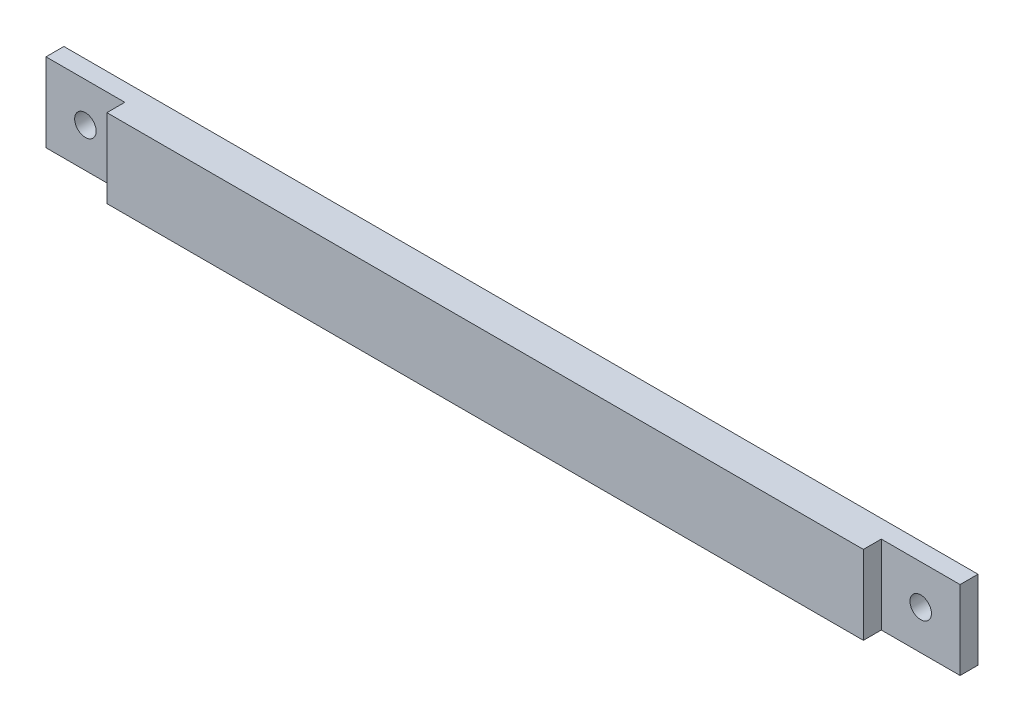
ISO-10303-21;
HEADER;
FILE_DESCRIPTION(('STEP AP214'),'2;1');
FILE_NAME('part.step','',(''),(''),'','','');
FILE_SCHEMA(('AUTOMOTIVE_DESIGN { 1 0 10303 214 1 1 1 1 }'));
ENDSEC;
DATA;
#1=APPLICATION_CONTEXT('core data for automotive mechanical design processes');
#2=APPLICATION_PROTOCOL_DEFINITION('international standard','automotive_design',2000,#1);
#3=PRODUCT_CONTEXT('',#1,'mechanical');
#4=PRODUCT('Part','Part','',(#3));
#5=PRODUCT_RELATED_PRODUCT_CATEGORY('part','',(#4));
#6=PRODUCT_DEFINITION_FORMATION('','',#4);
#7=PRODUCT_DEFINITION_CONTEXT('part definition',#1,'design');
#8=PRODUCT_DEFINITION('design','',#6,#7);
#9=PRODUCT_DEFINITION_SHAPE('','',#8);
#10=(LENGTH_UNIT() NAMED_UNIT(*) SI_UNIT(.MILLI.,.METRE.));
#11=(NAMED_UNIT(*) PLANE_ANGLE_UNIT() SI_UNIT($,.RADIAN.));
#12=(NAMED_UNIT(*) SI_UNIT($,.STERADIAN.) SOLID_ANGLE_UNIT());
#13=UNCERTAINTY_MEASURE_WITH_UNIT(LENGTH_MEASURE(1.E-05),#10,'distance_accuracy_value','');
#14=(GEOMETRIC_REPRESENTATION_CONTEXT(3) GLOBAL_UNCERTAINTY_ASSIGNED_CONTEXT((#13)) GLOBAL_UNIT_ASSIGNED_CONTEXT((#10,
#11,#12)) REPRESENTATION_CONTEXT('',''));
#15=CARTESIAN_POINT('',(0.,0.,0.));
#16=DIRECTION('',(0.,0.,1.));
#17=DIRECTION('',(1.,0.,0.));
#18=AXIS2_PLACEMENT_3D('',#15,#16,#17);
#19=CARTESIAN_POINT('',(-102.52841967404,45.85625,10.));
#20=DIRECTION('',(1.,0.,0.));
#21=DIRECTION('',(0.,1.,0.));
#22=AXIS2_PLACEMENT_3D('',#19,#20,#21);
#23=PLANE('',#22);
#24=DIRECTION('',(0.,-1.,0.));
#25=VECTOR('',#24,1.);
#26=CARTESIAN_POINT('',(-102.52841967404,45.85625,5.));
#27=LINE('',#26,#25);
#28=CARTESIAN_POINT('',(-102.52841967404,45.85625,5.));
#29=VERTEX_POINT('',#28);
#30=CARTESIAN_POINT('',(-102.52841967404,23.85625,5.));
#31=VERTEX_POINT('',#30);
#32=EDGE_CURVE('E110',#29,#31,#27,.T.);
#33=ORIENTED_EDGE('',*,*,#32,.F.);
#34=DIRECTION('',(0.,0.,-1.));
#35=VECTOR('',#34,1.);
#36=CARTESIAN_POINT('',(-102.52841967404,45.85625,10.));
#37=LINE('',#36,#35);
#38=CARTESIAN_POINT('',(-102.52841967404,45.85625,0.));
#39=VERTEX_POINT('',#38);
#40=EDGE_CURVE('E134',#29,#39,#37,.T.);
#41=ORIENTED_EDGE('',*,*,#40,.T.);
#42=DIRECTION('',(0.,-1.,0.));
#43=VECTOR('',#42,1.);
#44=CARTESIAN_POINT('',(-102.52841967404,45.85625,0.));
#45=LINE('',#44,#43);
#46=CARTESIAN_POINT('',(-102.52841967404,23.85625,0.));
#47=VERTEX_POINT('',#46);
#48=EDGE_CURVE('E133',#39,#47,#45,.T.);
#49=ORIENTED_EDGE('',*,*,#48,.T.);
#50=DIRECTION('',(0.,0.,-1.));
#51=VECTOR('',#50,1.);
#52=CARTESIAN_POINT('',(-102.52841967404,23.85625,10.));
#53=LINE('',#52,#51);
#54=EDGE_CURVE('E11',#31,#47,#53,.T.);
#55=ORIENTED_EDGE('',*,*,#54,.F.);
#56=EDGE_LOOP('',(#33,#41,#49,#55));
#57=FACE_BOUND('',#56,.T.);
#58=ADVANCED_FACE('F45',(#57),#23,.F.);
#59=CARTESIAN_POINT('',(-91.5284196740396,34.85625,10.));
#60=DIRECTION('',(0.,0.,-1.));
#61=DIRECTION('',(-1.,0.,0.));
#62=AXIS2_PLACEMENT_3D('',#59,#60,#61);
#63=CYLINDRICAL_SURFACE('',#62,3.00000000000001);
#64=CARTESIAN_POINT('',(-91.5284196740396,34.85625,0.));
#65=DIRECTION('',(0.,0.,1.));
#66=DIRECTION('',(1.,0.,0.));
#67=AXIS2_PLACEMENT_3D('',#64,#65,#66);
#68=CIRCLE('',#67,3.00000000000001);
#69=CARTESIAN_POINT('',(-88.5284196740396,34.85625,0.));
#70=VERTEX_POINT('',#69);
#71=EDGE_CURVE('E140',#70,#70,#68,.T.);
#72=ORIENTED_EDGE('',*,*,#71,.F.);
#73=EDGE_LOOP('',(#72));
#74=FACE_BOUND('',#73,.T.);
#75=CARTESIAN_POINT('',(-91.5284196740396,34.85625,5.));
#76=DIRECTION('',(0.,0.,1.));
#77=DIRECTION('',(1.,0.,0.));
#78=AXIS2_PLACEMENT_3D('',#75,#76,#77);
#79=CIRCLE('',#78,3.00000000000001);
#80=CARTESIAN_POINT('',(-88.5284196740396,34.85625,5.));
#81=VERTEX_POINT('',#80);
#82=EDGE_CURVE('E48',#81,#81,#79,.T.);
#83=ORIENTED_EDGE('',*,*,#82,.T.);
#84=EDGE_LOOP('',(#83));
#85=FACE_BOUND('',#84,.T.);
#86=ADVANCED_FACE('F236',(#74,#85),#63,.F.);
#87=CARTESIAN_POINT('',(0.,0.,10.));
#88=DIRECTION('',(0.,0.,1.));
#89=DIRECTION('',(1.,0.,0.));
#90=AXIS2_PLACEMENT_3D('',#87,#88,#89);
#91=PLANE('',#90);
#92=DIRECTION('',(0.,1.,0.));
#93=VECTOR('',#92,1.);
#94=CARTESIAN_POINT('',(-80.5284196740396,45.85625,10.));
#95=LINE('',#94,#93);
#96=CARTESIAN_POINT('',(-80.5284196740396,23.85625,10.));
#97=VERTEX_POINT('',#96);
#98=CARTESIAN_POINT('',(-80.5284196740396,45.85625,10.));
#99=VERTEX_POINT('',#98);
#100=EDGE_CURVE('E121',#97,#99,#95,.T.);
#101=ORIENTED_EDGE('',*,*,#100,.F.);
#102=DIRECTION('',(1.,0.,0.));
#103=VECTOR('',#102,1.);
#104=CARTESIAN_POINT('',(-102.52841967404,23.85625,10.));
#105=LINE('',#104,#103);
#106=CARTESIAN_POINT('',(130.67158032596,23.85625,10.));
#107=VERTEX_POINT('',#106);
#108=EDGE_CURVE('E159',#97,#107,#105,.T.);
#109=ORIENTED_EDGE('',*,*,#108,.T.);
#110=DIRECTION('',(0.,-1.,0.));
#111=VECTOR('',#110,1.);
#112=CARTESIAN_POINT('',(130.67158032596,45.85625,10.));
#113=LINE('',#112,#111);
#114=CARTESIAN_POINT('',(130.67158032596,45.85625,10.));
#115=VERTEX_POINT('',#114);
#116=EDGE_CURVE('E193',#115,#107,#113,.T.);
#117=ORIENTED_EDGE('',*,*,#116,.F.);
#118=DIRECTION('',(-1.,0.,0.));
#119=VECTOR('',#118,1.);
#120=CARTESIAN_POINT('',(-102.52841967404,45.85625,10.));
#121=LINE('',#120,#119);
#122=EDGE_CURVE('E150',#115,#99,#121,.T.);
#123=ORIENTED_EDGE('',*,*,#122,.T.);
#124=EDGE_LOOP('',(#101,#109,#117,#123));
#125=FACE_BOUND('',#124,.T.);
#126=ADVANCED_FACE('F215',(#125),#91,.T.);
#127=CARTESIAN_POINT('',(0.,0.,0.));
#128=DIRECTION('',(0.,0.,1.));
#129=DIRECTION('',(1.,0.,0.));
#130=AXIS2_PLACEMENT_3D('',#127,#128,#129);
#131=PLANE('',#130);
#132=ORIENTED_EDGE('',*,*,#48,.F.);
#133=DIRECTION('',(-1.,0.,0.));
#134=VECTOR('',#133,1.);
#135=CARTESIAN_POINT('',(-102.52841967404,45.85625,0.));
#136=LINE('',#135,#134);
#137=CARTESIAN_POINT('',(152.67158032596,45.85625,0.));
#138=VERTEX_POINT('',#137);
#139=EDGE_CURVE('E156',#138,#39,#136,.T.);
#140=ORIENTED_EDGE('',*,*,#139,.F.);
#141=DIRECTION('',(0.,1.,0.));
#142=VECTOR('',#141,1.);
#143=CARTESIAN_POINT('',(152.67158032596,45.85625,0.));
#144=LINE('',#143,#142);
#145=CARTESIAN_POINT('',(152.67158032596,23.85625,0.));
#146=VERTEX_POINT('',#145);
#147=EDGE_CURVE('E144',#146,#138,#144,.T.);
#148=ORIENTED_EDGE('',*,*,#147,.F.);
#149=DIRECTION('',(1.,0.,0.));
#150=VECTOR('',#149,1.);
#151=CARTESIAN_POINT('',(-102.52841967404,23.85625,0.));
#152=LINE('',#151,#150);
#153=EDGE_CURVE('E139',#47,#146,#152,.T.);
#154=ORIENTED_EDGE('',*,*,#153,.F.);
#155=EDGE_LOOP('',(#132,#140,#148,#154));
#156=FACE_BOUND('',#155,.T.);
#157=ORIENTED_EDGE('',*,*,#71,.T.);
#158=EDGE_LOOP('',(#157));
#159=FACE_BOUND('',#158,.T.);
#160=CARTESIAN_POINT('',(141.67158032596,34.85625,0.));
#161=DIRECTION('',(0.,0.,1.));
#162=DIRECTION('',(1.,0.,0.));
#163=AXIS2_PLACEMENT_3D('',#160,#161,#162);
#164=CIRCLE('',#163,2.99999999999999);
#165=CARTESIAN_POINT('',(144.67158032596,34.85625,0.));
#166=VERTEX_POINT('',#165);
#167=EDGE_CURVE('E147',#166,#166,#164,.T.);
#168=ORIENTED_EDGE('',*,*,#167,.T.);
#169=EDGE_LOOP('',(#168));
#170=FACE_BOUND('',#169,.T.);
#171=ADVANCED_FACE('F246',(#156,#159,#170),#131,.F.);
#172=CARTESIAN_POINT('',(-102.52841967404,23.85625,10.));
#173=DIRECTION('',(0.,1.,0.));
#174=DIRECTION('',(0.,0.,1.));
#175=AXIS2_PLACEMENT_3D('',#172,#173,#174);
#176=PLANE('',#175);
#177=ORIENTED_EDGE('',*,*,#108,.F.);
#178=DIRECTION('',(0.,0.,1.));
#179=VECTOR('',#178,1.);
#180=CARTESIAN_POINT('',(-80.5284196740396,23.85625,5.));
#181=LINE('',#180,#179);
#182=CARTESIAN_POINT('',(-80.5284196740396,23.85625,5.));
#183=VERTEX_POINT('',#182);
#184=EDGE_CURVE('E128',#183,#97,#181,.T.);
#185=ORIENTED_EDGE('',*,*,#184,.F.);
#186=DIRECTION('',(1.,0.,0.));
#187=VECTOR('',#186,1.);
#188=CARTESIAN_POINT('',(-102.52841967404,23.85625,5.));
#189=LINE('',#188,#187);
#190=EDGE_CURVE('E113',#31,#183,#189,.T.);
#191=ORIENTED_EDGE('',*,*,#190,.F.);
#192=ORIENTED_EDGE('',*,*,#54,.T.);
#193=ORIENTED_EDGE('',*,*,#153,.T.);
#194=DIRECTION('',(0.,0.,-1.));
#195=VECTOR('',#194,1.);
#196=CARTESIAN_POINT('',(152.67158032596,23.85625,10.));
#197=LINE('',#196,#195);
#198=CARTESIAN_POINT('',(152.67158032596,23.85625,5.));
#199=VERTEX_POINT('',#198);
#200=EDGE_CURVE('E54',#199,#146,#197,.T.);
#201=ORIENTED_EDGE('',*,*,#200,.F.);
#202=DIRECTION('',(1.,0.,0.));
#203=VECTOR('',#202,1.);
#204=CARTESIAN_POINT('',(152.67158032596,23.85625,5.));
#205=LINE('',#204,#203);
#206=CARTESIAN_POINT('',(130.67158032596,23.85625,5.));
#207=VERTEX_POINT('',#206);
#208=EDGE_CURVE('E188',#207,#199,#205,.T.);
#209=ORIENTED_EDGE('',*,*,#208,.F.);
#210=DIRECTION('',(0.,0.,1.));
#211=VECTOR('',#210,1.);
#212=CARTESIAN_POINT('',(130.67158032596,23.85625,5.));
#213=LINE('',#212,#211);
#214=EDGE_CURVE('E189',#207,#107,#213,.T.);
#215=ORIENTED_EDGE('',*,*,#214,.T.);
#216=EDGE_LOOP('',(#177,#185,#191,#192,#193,#201,#209,#215));
#217=FACE_BOUND('',#216,.T.);
#218=ADVANCED_FACE('F125',(#217),#176,.F.);
#219=CARTESIAN_POINT('',(152.67158032596,45.85625,10.));
#220=DIRECTION('',(-1.,0.,0.));
#221=DIRECTION('',(0.,0.,1.));
#222=AXIS2_PLACEMENT_3D('',#219,#220,#221);
#223=PLANE('',#222);
#224=DIRECTION('',(0.,0.,-1.));
#225=VECTOR('',#224,1.);
#226=CARTESIAN_POINT('',(152.67158032596,45.85625,10.));
#227=LINE('',#226,#225);
#228=CARTESIAN_POINT('',(152.67158032596,45.85625,5.));
#229=VERTEX_POINT('',#228);
#230=EDGE_CURVE('E162',#229,#138,#227,.T.);
#231=ORIENTED_EDGE('',*,*,#230,.F.);
#232=DIRECTION('',(0.,1.,0.));
#233=VECTOR('',#232,1.);
#234=CARTESIAN_POINT('',(152.67158032596,45.85625,5.));
#235=LINE('',#234,#233);
#236=EDGE_CURVE('E70',#199,#229,#235,.T.);
#237=ORIENTED_EDGE('',*,*,#236,.F.);
#238=ORIENTED_EDGE('',*,*,#200,.T.);
#239=ORIENTED_EDGE('',*,*,#147,.T.);
#240=EDGE_LOOP('',(#231,#237,#238,#239));
#241=FACE_BOUND('',#240,.T.);
#242=ADVANCED_FACE('F254',(#241),#223,.F.);
#243=CARTESIAN_POINT('',(-102.52841967404,45.85625,10.));
#244=DIRECTION('',(0.,-1.,0.));
#245=DIRECTION('',(0.,0.,-1.));
#246=AXIS2_PLACEMENT_3D('',#243,#244,#245);
#247=PLANE('',#246);
#248=DIRECTION('',(-1.,0.,0.));
#249=VECTOR('',#248,1.);
#250=CARTESIAN_POINT('',(-102.52841967404,45.85625,5.));
#251=LINE('',#250,#249);
#252=CARTESIAN_POINT('',(-80.5284196740396,45.85625,5.));
#253=VERTEX_POINT('',#252);
#254=EDGE_CURVE('E116',#253,#29,#251,.T.);
#255=ORIENTED_EDGE('',*,*,#254,.F.);
#256=DIRECTION('',(0.,0.,1.));
#257=VECTOR('',#256,1.);
#258=CARTESIAN_POINT('',(-80.5284196740396,45.85625,5.));
#259=LINE('',#258,#257);
#260=EDGE_CURVE('E169',#253,#99,#259,.T.);
#261=ORIENTED_EDGE('',*,*,#260,.T.);
#262=ORIENTED_EDGE('',*,*,#122,.F.);
#263=DIRECTION('',(0.,0.,1.));
#264=VECTOR('',#263,1.);
#265=CARTESIAN_POINT('',(130.67158032596,45.85625,5.));
#266=LINE('',#265,#264);
#267=CARTESIAN_POINT('',(130.67158032596,45.85625,5.));
#268=VERTEX_POINT('',#267);
#269=EDGE_CURVE('E185',#268,#115,#266,.T.);
#270=ORIENTED_EDGE('',*,*,#269,.F.);
#271=DIRECTION('',(-1.,0.,0.));
#272=VECTOR('',#271,1.);
#273=CARTESIAN_POINT('',(152.67158032596,45.85625,5.));
#274=LINE('',#273,#272);
#275=EDGE_CURVE('E202',#229,#268,#274,.T.);
#276=ORIENTED_EDGE('',*,*,#275,.F.);
#277=ORIENTED_EDGE('',*,*,#230,.T.);
#278=ORIENTED_EDGE('',*,*,#139,.T.);
#279=ORIENTED_EDGE('',*,*,#40,.F.);
#280=EDGE_LOOP('',(#255,#261,#262,#270,#276,#277,#278,#279));
#281=FACE_BOUND('',#280,.T.);
#282=ADVANCED_FACE('F217',(#281),#247,.F.);
#283=CARTESIAN_POINT('',(141.67158032596,34.85625,10.));
#284=DIRECTION('',(0.,0.,-1.));
#285=DIRECTION('',(-1.,0.,0.));
#286=AXIS2_PLACEMENT_3D('',#283,#284,#285);
#287=CYLINDRICAL_SURFACE('',#286,2.99999999999999);
#288=CARTESIAN_POINT('',(141.67158032596,34.85625,5.));
#289=DIRECTION('',(0.,0.,-1.));
#290=DIRECTION('',(-1.,0.,0.));
#291=AXIS2_PLACEMENT_3D('',#288,#289,#290);
#292=CIRCLE('',#291,2.99999999999999);
#293=CARTESIAN_POINT('',(138.67158032596,34.85625,5.));
#294=VERTEX_POINT('',#293);
#295=EDGE_CURVE('E166',#294,#294,#292,.T.);
#296=ORIENTED_EDGE('',*,*,#295,.F.);
#297=EDGE_LOOP('',(#296));
#298=FACE_BOUND('',#297,.T.);
#299=ORIENTED_EDGE('',*,*,#167,.F.);
#300=EDGE_LOOP('',(#299));
#301=FACE_BOUND('',#300,.T.);
#302=ADVANCED_FACE('F232',(#298,#301),#287,.F.);
#303=CARTESIAN_POINT('',(130.67158032596,45.85625,5.));
#304=DIRECTION('',(-1.,0.,0.));
#305=DIRECTION('',(0.,0.,1.));
#306=AXIS2_PLACEMENT_3D('',#303,#304,#305);
#307=PLANE('',#306);
#308=ORIENTED_EDGE('',*,*,#116,.T.);
#309=ORIENTED_EDGE('',*,*,#214,.F.);
#310=DIRECTION('',(0.,-1.,0.));
#311=VECTOR('',#310,1.);
#312=CARTESIAN_POINT('',(130.67158032596,45.85625,5.));
#313=LINE('',#312,#311);
#314=EDGE_CURVE('E198',#268,#207,#313,.T.);
#315=ORIENTED_EDGE('',*,*,#314,.F.);
#316=ORIENTED_EDGE('',*,*,#269,.T.);
#317=EDGE_LOOP('',(#308,#309,#315,#316));
#318=FACE_BOUND('',#317,.T.);
#319=ADVANCED_FACE('F220',(#318),#307,.F.);
#320=CARTESIAN_POINT('',(0.,0.,5.));
#321=DIRECTION('',(0.,0.,-1.));
#322=DIRECTION('',(-1.,0.,0.));
#323=AXIS2_PLACEMENT_3D('',#320,#321,#322);
#324=PLANE('',#323);
#325=ORIENTED_EDGE('',*,*,#295,.T.);
#326=EDGE_LOOP('',(#325));
#327=FACE_BOUND('',#326,.T.);
#328=ORIENTED_EDGE('',*,*,#236,.T.);
#329=ORIENTED_EDGE('',*,*,#275,.T.);
#330=ORIENTED_EDGE('',*,*,#314,.T.);
#331=ORIENTED_EDGE('',*,*,#208,.T.);
#332=EDGE_LOOP('',(#328,#329,#330,#331));
#333=FACE_BOUND('',#332,.T.);
#334=ADVANCED_FACE('F222',(#327,#333),#324,.F.);
#335=CARTESIAN_POINT('',(-80.5284196740396,45.85625,5.));
#336=DIRECTION('',(1.,0.,0.));
#337=DIRECTION('',(0.,0.,-1.));
#338=AXIS2_PLACEMENT_3D('',#335,#336,#337);
#339=PLANE('',#338);
#340=ORIENTED_EDGE('',*,*,#100,.T.);
#341=ORIENTED_EDGE('',*,*,#260,.F.);
#342=DIRECTION('',(0.,1.,0.));
#343=VECTOR('',#342,1.);
#344=CARTESIAN_POINT('',(-80.5284196740396,45.85625,5.));
#345=LINE('',#344,#343);
#346=EDGE_CURVE('E62',#183,#253,#345,.T.);
#347=ORIENTED_EDGE('',*,*,#346,.F.);
#348=ORIENTED_EDGE('',*,*,#184,.T.);
#349=EDGE_LOOP('',(#340,#341,#347,#348));
#350=FACE_BOUND('',#349,.T.);
#351=ADVANCED_FACE('F224',(#350),#339,.F.);
#352=CARTESIAN_POINT('',(0.,0.,5.));
#353=DIRECTION('',(0.,0.,1.));
#354=DIRECTION('',(1.,0.,0.));
#355=AXIS2_PLACEMENT_3D('',#352,#353,#354);
#356=PLANE('',#355);
#357=ORIENTED_EDGE('',*,*,#82,.F.);
#358=EDGE_LOOP('',(#357));
#359=FACE_BOUND('',#358,.T.);
#360=ORIENTED_EDGE('',*,*,#32,.T.);
#361=ORIENTED_EDGE('',*,*,#190,.T.);
#362=ORIENTED_EDGE('',*,*,#346,.T.);
#363=ORIENTED_EDGE('',*,*,#254,.T.);
#364=EDGE_LOOP('',(#360,#361,#362,#363));
#365=FACE_BOUND('',#364,.T.);
#366=ADVANCED_FACE('F112',(#359,#365),#356,.T.);
#367=CLOSED_SHELL('',(#58,#86,#126,#171,#218,#242,#282,#302,#319,#334,#351,#366));
#368=MANIFOLD_SOLID_BREP('B2',#367);
#369=ADVANCED_BREP_SHAPE_REPRESENTATION('',(#18,#368),#14);
#370=SHAPE_DEFINITION_REPRESENTATION(#9,#369);
ENDSEC;
END-ISO-10303-21;
